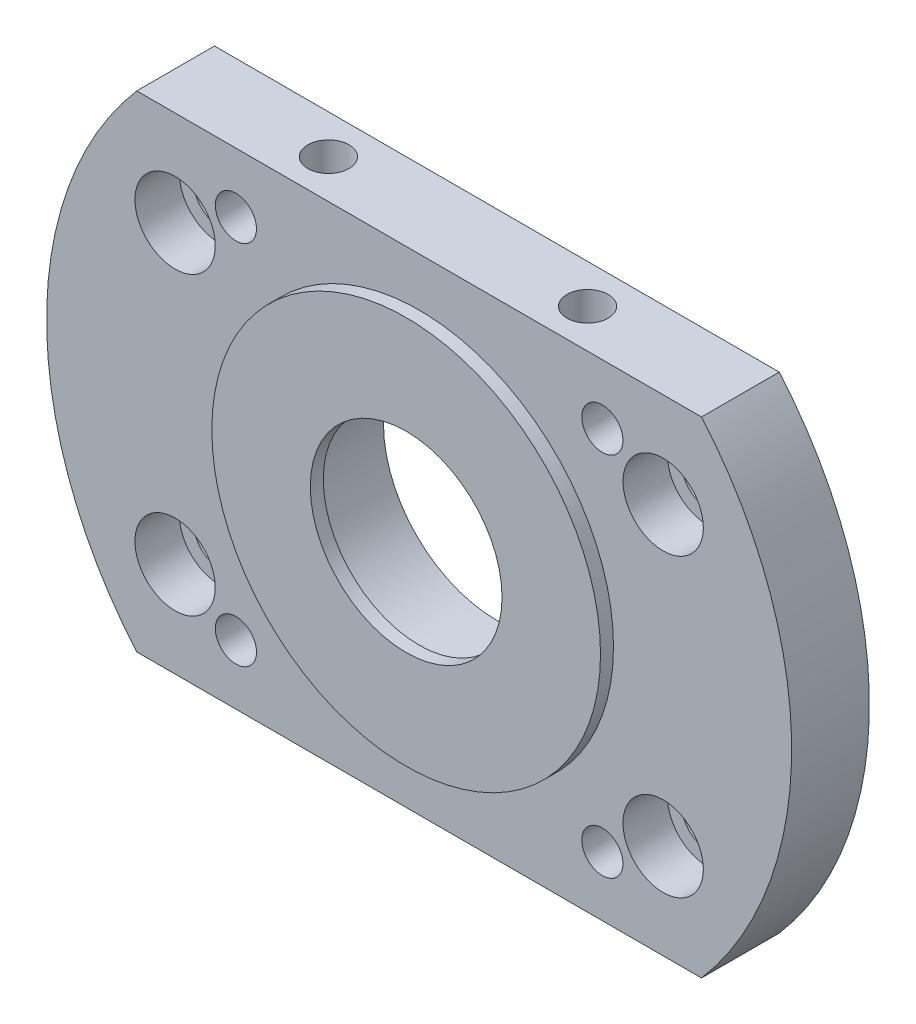
ISO-10303-21;
HEADER;
FILE_DESCRIPTION(('STEP AP214'),'2;1');
FILE_NAME('part.step','',(''),(''),'','','');
FILE_SCHEMA(('AUTOMOTIVE_DESIGN { 1 0 10303 214 1 1 1 1 }'));
ENDSEC;
DATA;
#1=APPLICATION_CONTEXT('core data for automotive mechanical design processes');
#2=APPLICATION_PROTOCOL_DEFINITION('international standard','automotive_design',2000,#1);
#3=PRODUCT_CONTEXT('',#1,'mechanical');
#4=PRODUCT('Part','Part','',(#3));
#5=PRODUCT_RELATED_PRODUCT_CATEGORY('part','',(#4));
#6=PRODUCT_DEFINITION_FORMATION('','',#4);
#7=PRODUCT_DEFINITION_CONTEXT('part definition',#1,'design');
#8=PRODUCT_DEFINITION('design','',#6,#7);
#9=PRODUCT_DEFINITION_SHAPE('','',#8);
#10=(LENGTH_UNIT() NAMED_UNIT(*) SI_UNIT(.MILLI.,.METRE.));
#11=(NAMED_UNIT(*) PLANE_ANGLE_UNIT() SI_UNIT($,.RADIAN.));
#12=(NAMED_UNIT(*) SI_UNIT($,.STERADIAN.) SOLID_ANGLE_UNIT());
#13=UNCERTAINTY_MEASURE_WITH_UNIT(LENGTH_MEASURE(1.E-05),#10,'distance_accuracy_value','');
#14=(GEOMETRIC_REPRESENTATION_CONTEXT(3) GLOBAL_UNCERTAINTY_ASSIGNED_CONTEXT((#13)) GLOBAL_UNIT_ASSIGNED_CONTEXT((#10,
#11,#12)) REPRESENTATION_CONTEXT('',''));
#15=CARTESIAN_POINT('',(0.,0.,0.));
#16=DIRECTION('',(0.,0.,1.));
#17=DIRECTION('',(1.,0.,0.));
#18=AXIS2_PLACEMENT_3D('',#15,#16,#17);
#19=CARTESIAN_POINT('',(0.,0.,8.89000000000001));
#20=DIRECTION('',(0.,0.,1.));
#21=DIRECTION('',(1.,0.,0.));
#22=AXIS2_PLACEMENT_3D('',#19,#20,#21);
#23=PLANE('',#22);
#24=CARTESIAN_POINT('',(0.,0.,8.89000000000001));
#25=DIRECTION('',(0.,0.,-1.));
#26=DIRECTION('',(-1.,0.,0.));
#27=AXIS2_PLACEMENT_3D('',#24,#25,#26);
#28=CIRCLE('',#27,19.05);
#29=CARTESIAN_POINT('',(-19.05,0.,8.89000000000001));
#30=VERTEX_POINT('',#29);
#31=EDGE_CURVE('E197',#30,#30,#28,.T.);
#32=ORIENTED_EDGE('',*,*,#31,.F.);
#33=EDGE_LOOP('',(#32));
#34=FACE_BOUND('',#33,.T.);
#35=CARTESIAN_POINT('',(0.,0.,8.89000000000001));
#36=DIRECTION('',(0.,0.,1.));
#37=DIRECTION('',(1.,0.,0.));
#38=AXIS2_PLACEMENT_3D('',#35,#36,#37);
#39=CIRCLE('',#38,9.398);
#40=CARTESIAN_POINT('',(9.398,0.,8.89000000000001));
#41=VERTEX_POINT('',#40);
#42=EDGE_CURVE('E18',#41,#41,#39,.F.);
#43=ORIENTED_EDGE('',*,*,#42,.T.);
#44=EDGE_LOOP('',(#43));
#45=FACE_BOUND('',#44,.T.);
#46=ADVANCED_FACE('F15',(#34,#45),#23,.T.);
#47=CARTESIAN_POINT('',(0.,0.,0.));
#48=DIRECTION('',(0.,0.,1.));
#49=DIRECTION('',(1.,0.,0.));
#50=AXIS2_PLACEMENT_3D('',#47,#48,#49);
#51=CYLINDRICAL_SURFACE('',#50,9.398);
#52=ORIENTED_EDGE('',*,*,#42,.F.);
#53=EDGE_LOOP('',(#52));
#54=FACE_BOUND('',#53,.T.);
#55=CARTESIAN_POINT('',(0.,0.,7.61999999999999));
#56=DIRECTION('',(0.,0.,1.));
#57=DIRECTION('',(1.,0.,0.));
#58=AXIS2_PLACEMENT_3D('',#55,#56,#57);
#59=CIRCLE('',#58,9.398);
#60=CARTESIAN_POINT('',(9.398,0.,7.61999999999999));
#61=VERTEX_POINT('',#60);
#62=EDGE_CURVE('E79',#61,#61,#59,.T.);
#63=ORIENTED_EDGE('',*,*,#62,.F.);
#64=EDGE_LOOP('',(#63));
#65=FACE_BOUND('',#64,.T.);
#66=ADVANCED_FACE('F72',(#54,#65),#51,.F.);
#67=CARTESIAN_POINT('',(12.7,13.6524999998642,3.81000000000001));
#68=DIRECTION('',(0.,1.,0.));
#69=DIRECTION('',(0.,0.,1.));
#70=AXIS2_PLACEMENT_3D('',#67,#68,#69);
#71=CONICAL_SURFACE('',#70,2.01929999990255,1.0297442584718);
#72=CARTESIAN_POINT('',(12.7,12.4391821518088,3.81000000018616));
#73=VERTEX_POINT('',#72);
#74=VERTEX_LOOP('',#73);
#75=FACE_BOUND('',#74,.T.);
#76=CARTESIAN_POINT('',(12.7,13.6525,3.81000000000001));
#77=DIRECTION('',(0.,1.,0.));
#78=DIRECTION('',(0.,0.,1.));
#79=AXIS2_PLACEMENT_3D('',#76,#77,#78);
#80=CIRCLE('',#79,2.01929999999999);
#81=CARTESIAN_POINT('',(12.7,13.6525,5.8293));
#82=VERTEX_POINT('',#81);
#83=EDGE_CURVE('E76',#82,#82,#80,.T.);
#84=ORIENTED_EDGE('',*,*,#83,.T.);
#85=EDGE_LOOP('',(#84));
#86=FACE_BOUND('',#85,.T.);
#87=ADVANCED_FACE('F68',(#75,#86),#71,.F.);
#88=CARTESIAN_POINT('',(-12.7,13.652499999921,3.81000000000001));
#89=DIRECTION('',(0.,1.,0.));
#90=DIRECTION('',(-1.,0.,0.));
#91=AXIS2_PLACEMENT_3D('',#88,#89,#90);
#92=CONICAL_SURFACE('',#91,2.0192999999594,1.02974425849666);
#93=CARTESIAN_POINT('',(-12.7,12.439182151752,3.80999999991474));
#94=VERTEX_POINT('',#93);
#95=VERTEX_LOOP('',#94);
#96=FACE_BOUND('',#95,.T.);
#97=CARTESIAN_POINT('',(-12.7,13.6525,3.81000000000001));
#98=DIRECTION('',(0.,1.,0.));
#99=DIRECTION('',(0.,0.,1.));
#100=AXIS2_PLACEMENT_3D('',#97,#98,#99);
#101=CIRCLE('',#100,2.01929999999999);
#102=CARTESIAN_POINT('',(-12.7,13.6525,5.8293));
#103=VERTEX_POINT('',#102);
#104=EDGE_CURVE('E78',#103,#103,#101,.T.);
#105=ORIENTED_EDGE('',*,*,#104,.T.);
#106=EDGE_LOOP('',(#105));
#107=FACE_BOUND('',#106,.T.);
#108=ADVANCED_FACE('F71',(#96,#107),#92,.F.);
#109=CARTESIAN_POINT('',(23.920649603501,14.5,7.61999999999999));
#110=DIRECTION('',(0.,0.,1.));
#111=DIRECTION('',(1.,0.,0.));
#112=AXIS2_PLACEMENT_3D('',#109,#110,#111);
#113=CYLINDRICAL_SURFACE('',#112,3.937);
#114=CARTESIAN_POINT('',(23.920649603501,14.5,7.61999999999999));
#115=DIRECTION('',(0.,0.,1.));
#116=DIRECTION('',(1.,0.,0.));
#117=AXIS2_PLACEMENT_3D('',#114,#115,#116);
#118=CIRCLE('',#117,3.937);
#119=CARTESIAN_POINT('',(27.857649603501,14.5,7.61999999999999));
#120=VERTEX_POINT('',#119);
#121=EDGE_CURVE('E82',#120,#120,#118,.F.);
#122=ORIENTED_EDGE('',*,*,#121,.F.);
#123=EDGE_LOOP('',(#122));
#124=FACE_BOUND('',#123,.T.);
#125=CARTESIAN_POINT('',(23.920649603501,14.5,3.25120000000001));
#126=DIRECTION('',(0.,0.,1.));
#127=DIRECTION('',(1.,0.,0.));
#128=AXIS2_PLACEMENT_3D('',#125,#126,#127);
#129=CIRCLE('',#128,3.937);
#130=CARTESIAN_POINT('',(27.857649603501,14.5,3.25120000000001));
#131=VERTEX_POINT('',#130);
#132=EDGE_CURVE('E195',#131,#131,#129,.F.);
#133=ORIENTED_EDGE('',*,*,#132,.T.);
#134=EDGE_LOOP('',(#133));
#135=FACE_BOUND('',#134,.T.);
#136=ADVANCED_FACE('F288',(#124,#135),#113,.F.);
#137=CARTESIAN_POINT('',(23.920649603501,-14.5,7.61999999999999));
#138=DIRECTION('',(0.,0.,1.));
#139=DIRECTION('',(1.,0.,0.));
#140=AXIS2_PLACEMENT_3D('',#137,#138,#139);
#141=CYLINDRICAL_SURFACE('',#140,3.937);
#142=CARTESIAN_POINT('',(23.920649603501,-14.5,7.61999999999999));
#143=DIRECTION('',(0.,0.,1.));
#144=DIRECTION('',(1.,0.,0.));
#145=AXIS2_PLACEMENT_3D('',#142,#143,#144);
#146=CIRCLE('',#145,3.937);
#147=CARTESIAN_POINT('',(27.857649603501,-14.5,7.61999999999999));
#148=VERTEX_POINT('',#147);
#149=EDGE_CURVE('E182',#148,#148,#146,.F.);
#150=ORIENTED_EDGE('',*,*,#149,.F.);
#151=EDGE_LOOP('',(#150));
#152=FACE_BOUND('',#151,.T.);
#153=CARTESIAN_POINT('',(23.920649603501,-14.5,3.25120000000001));
#154=DIRECTION('',(0.,0.,1.));
#155=DIRECTION('',(1.,0.,0.));
#156=AXIS2_PLACEMENT_3D('',#153,#154,#155);
#157=CIRCLE('',#156,3.937);
#158=CARTESIAN_POINT('',(27.857649603501,-14.5,3.25120000000001));
#159=VERTEX_POINT('',#158);
#160=EDGE_CURVE('E192',#159,#159,#157,.F.);
#161=ORIENTED_EDGE('',*,*,#160,.T.);
#162=EDGE_LOOP('',(#161));
#163=FACE_BOUND('',#162,.T.);
#164=ADVANCED_FACE('F284',(#152,#163),#141,.F.);
#165=CARTESIAN_POINT('',(-23.920649603501,-14.5,7.61999999999999));
#166=DIRECTION('',(0.,0.,1.));
#167=DIRECTION('',(1.,0.,0.));
#168=AXIS2_PLACEMENT_3D('',#165,#166,#167);
#169=CYLINDRICAL_SURFACE('',#168,3.937);
#170=CARTESIAN_POINT('',(-23.920649603501,-14.5,7.61999999999999));
#171=DIRECTION('',(0.,0.,1.));
#172=DIRECTION('',(1.,0.,0.));
#173=AXIS2_PLACEMENT_3D('',#170,#171,#172);
#174=CIRCLE('',#173,3.937);
#175=CARTESIAN_POINT('',(-19.983649603501,-14.5,7.61999999999999));
#176=VERTEX_POINT('',#175);
#177=EDGE_CURVE('E179',#176,#176,#174,.F.);
#178=ORIENTED_EDGE('',*,*,#177,.F.);
#179=EDGE_LOOP('',(#178));
#180=FACE_BOUND('',#179,.T.);
#181=CARTESIAN_POINT('',(-23.920649603501,-14.5,3.25120000000001));
#182=DIRECTION('',(0.,0.,1.));
#183=DIRECTION('',(1.,0.,0.));
#184=AXIS2_PLACEMENT_3D('',#181,#182,#183);
#185=CIRCLE('',#184,3.937);
#186=CARTESIAN_POINT('',(-19.983649603501,-14.5,3.25120000000001));
#187=VERTEX_POINT('',#186);
#188=EDGE_CURVE('E189',#187,#187,#185,.F.);
#189=ORIENTED_EDGE('',*,*,#188,.T.);
#190=EDGE_LOOP('',(#189));
#191=FACE_BOUND('',#190,.T.);
#192=ADVANCED_FACE('F280',(#180,#191),#169,.F.);
#193=CARTESIAN_POINT('',(-23.920649603501,14.5,7.61999999999999));
#194=DIRECTION('',(0.,0.,1.));
#195=DIRECTION('',(1.,0.,0.));
#196=AXIS2_PLACEMENT_3D('',#193,#194,#195);
#197=CYLINDRICAL_SURFACE('',#196,3.937);
#198=CARTESIAN_POINT('',(-23.920649603501,14.5,7.61999999999999));
#199=DIRECTION('',(0.,0.,1.));
#200=DIRECTION('',(1.,0.,0.));
#201=AXIS2_PLACEMENT_3D('',#198,#199,#200);
#202=CIRCLE('',#201,3.937);
#203=CARTESIAN_POINT('',(-19.983649603501,14.5,7.61999999999999));
#204=VERTEX_POINT('',#203);
#205=EDGE_CURVE('E176',#204,#204,#202,.F.);
#206=ORIENTED_EDGE('',*,*,#205,.F.);
#207=EDGE_LOOP('',(#206));
#208=FACE_BOUND('',#207,.T.);
#209=CARTESIAN_POINT('',(-23.920649603501,14.5,3.25120000000001));
#210=DIRECTION('',(0.,0.,1.));
#211=DIRECTION('',(1.,0.,0.));
#212=AXIS2_PLACEMENT_3D('',#209,#210,#211);
#213=CIRCLE('',#212,3.937);
#214=CARTESIAN_POINT('',(-19.983649603501,14.5,3.25120000000001));
#215=VERTEX_POINT('',#214);
#216=EDGE_CURVE('E85',#215,#215,#213,.F.);
#217=ORIENTED_EDGE('',*,*,#216,.T.);
#218=EDGE_LOOP('',(#217));
#219=FACE_BOUND('',#218,.T.);
#220=ADVANCED_FACE('F272',(#208,#219),#197,.F.);
#221=CARTESIAN_POINT('',(0.,0.,8.89000000000001));
#222=DIRECTION('',(0.,0.,-1.));
#223=DIRECTION('',(-1.,0.,0.));
#224=AXIS2_PLACEMENT_3D('',#221,#222,#223);
#225=CYLINDRICAL_SURFACE('',#224,19.05);
#226=CARTESIAN_POINT('',(0.,0.,7.61999999999999));
#227=DIRECTION('',(0.,0.,-1.));
#228=DIRECTION('',(-1.,0.,0.));
#229=AXIS2_PLACEMENT_3D('',#226,#227,#228);
#230=CIRCLE('',#229,19.05);
#231=CARTESIAN_POINT('',(-19.05,0.,7.61999999999999));
#232=VERTEX_POINT('',#231);
#233=EDGE_CURVE('E173',#232,#232,#230,.T.);
#234=ORIENTED_EDGE('',*,*,#233,.F.);
#235=EDGE_LOOP('',(#234));
#236=FACE_BOUND('',#235,.T.);
#237=ORIENTED_EDGE('',*,*,#31,.T.);
#238=EDGE_LOOP('',(#237));
#239=FACE_BOUND('',#238,.T.);
#240=ADVANCED_FACE('F261',(#236,#239),#225,.T.);
#241=CARTESIAN_POINT('',(26.473349603501,14.5,3.25120000000001));
#242=DIRECTION('',(0.,0.,-1.));
#243=DIRECTION('',(-1.,0.,0.));
#244=AXIS2_PLACEMENT_3D('',#241,#242,#243);
#245=PLANE('',#244);
#246=ORIENTED_EDGE('',*,*,#132,.F.);
#247=EDGE_LOOP('',(#246));
#248=FACE_BOUND('',#247,.T.);
#249=CARTESIAN_POINT('',(23.920649603501,14.5,3.25120000000001));
#250=DIRECTION('',(0.,0.,1.));
#251=DIRECTION('',(1.,0.,0.));
#252=AXIS2_PLACEMENT_3D('',#249,#250,#251);
#253=CIRCLE('',#252,2.5527);
#254=CARTESIAN_POINT('',(26.473349603501,14.5,3.25120000000001));
#255=VERTEX_POINT('',#254);
#256=EDGE_CURVE('E170',#255,#255,#253,.F.);
#257=ORIENTED_EDGE('',*,*,#256,.T.);
#258=EDGE_LOOP('',(#257));
#259=FACE_BOUND('',#258,.T.);
#260=ADVANCED_FACE('F258',(#248,#259),#245,.F.);
#261=CARTESIAN_POINT('',(26.473349603501,-14.5,3.25120000000001));
#262=DIRECTION('',(0.,0.,-1.));
#263=DIRECTION('',(-1.,0.,0.));
#264=AXIS2_PLACEMENT_3D('',#261,#262,#263);
#265=PLANE('',#264);
#266=ORIENTED_EDGE('',*,*,#160,.F.);
#267=EDGE_LOOP('',(#266));
#268=FACE_BOUND('',#267,.T.);
#269=CARTESIAN_POINT('',(23.920649603501,-14.5,3.25120000000001));
#270=DIRECTION('',(0.,0.,1.));
#271=DIRECTION('',(1.,0.,0.));
#272=AXIS2_PLACEMENT_3D('',#269,#270,#271);
#273=CIRCLE('',#272,2.5527);
#274=CARTESIAN_POINT('',(26.473349603501,-14.5,3.25120000000001));
#275=VERTEX_POINT('',#274);
#276=EDGE_CURVE('E167',#275,#275,#273,.F.);
#277=ORIENTED_EDGE('',*,*,#276,.T.);
#278=EDGE_LOOP('',(#277));
#279=FACE_BOUND('',#278,.T.);
#280=ADVANCED_FACE('F260',(#268,#279),#265,.F.);
#281=CARTESIAN_POINT('',(-21.367949603501,-14.5,3.25120000000001));
#282=DIRECTION('',(0.,0.,-1.));
#283=DIRECTION('',(-1.,0.,0.));
#284=AXIS2_PLACEMENT_3D('',#281,#282,#283);
#285=PLANE('',#284);
#286=ORIENTED_EDGE('',*,*,#188,.F.);
#287=EDGE_LOOP('',(#286));
#288=FACE_BOUND('',#287,.T.);
#289=CARTESIAN_POINT('',(-23.920649603501,-14.5,3.25120000000001));
#290=DIRECTION('',(0.,0.,1.));
#291=DIRECTION('',(1.,0.,0.));
#292=AXIS2_PLACEMENT_3D('',#289,#290,#291);
#293=CIRCLE('',#292,2.5527);
#294=CARTESIAN_POINT('',(-21.367949603501,-14.5,3.25120000000001));
#295=VERTEX_POINT('',#294);
#296=EDGE_CURVE('E164',#295,#295,#293,.F.);
#297=ORIENTED_EDGE('',*,*,#296,.T.);
#298=EDGE_LOOP('',(#297));
#299=FACE_BOUND('',#298,.T.);
#300=ADVANCED_FACE('F269',(#288,#299),#285,.F.);
#301=CARTESIAN_POINT('',(-21.367949603501,14.5,3.25120000000001));
#302=DIRECTION('',(0.,0.,-1.));
#303=DIRECTION('',(-1.,0.,0.));
#304=AXIS2_PLACEMENT_3D('',#301,#302,#303);
#305=PLANE('',#304);
#306=ORIENTED_EDGE('',*,*,#216,.F.);
#307=EDGE_LOOP('',(#306));
#308=FACE_BOUND('',#307,.T.);
#309=CARTESIAN_POINT('',(-23.920649603501,14.5,3.25120000000001));
#310=DIRECTION('',(0.,0.,1.));
#311=DIRECTION('',(1.,0.,0.));
#312=AXIS2_PLACEMENT_3D('',#309,#310,#311);
#313=CIRCLE('',#312,2.5527);
#314=CARTESIAN_POINT('',(-21.367949603501,14.5,3.25120000000001));
#315=VERTEX_POINT('',#314);
#316=EDGE_CURVE('E161',#315,#315,#313,.F.);
#317=ORIENTED_EDGE('',*,*,#316,.T.);
#318=EDGE_LOOP('',(#317));
#319=FACE_BOUND('',#318,.T.);
#320=ADVANCED_FACE('F325',(#308,#319),#305,.F.);
#321=CARTESIAN_POINT('',(-23.920649603501,0.,5.08));
#322=DIRECTION('',(0.,0.,-1.));
#323=DIRECTION('',(-1.,0.,0.));
#324=AXIS2_PLACEMENT_3D('',#321,#322,#323);
#325=PLANE('',#324);
#326=CARTESIAN_POINT('',(-23.920649603501,0.,5.08));
#327=DIRECTION('',(0.,0.,-1.));
#328=DIRECTION('',(-1.,0.,0.));
#329=AXIS2_PLACEMENT_3D('',#326,#327,#328);
#330=CIRCLE('',#329,9.52500000000001);
#331=CARTESIAN_POINT('',(-33.445649603501,0.,5.08));
#332=VERTEX_POINT('',#331);
#333=EDGE_CURVE('E146',#332,#332,#330,.T.);
#334=ORIENTED_EDGE('',*,*,#333,.T.);
#335=EDGE_LOOP('',(#334));
#336=FACE_BOUND('',#335,.T.);
#337=ADVANCED_FACE('F321',(#336),#325,.T.);
#338=CARTESIAN_POINT('',(23.920649603501,0.,5.08));
#339=DIRECTION('',(0.,0.,-1.));
#340=DIRECTION('',(-1.,0.,0.));
#341=AXIS2_PLACEMENT_3D('',#338,#339,#340);
#342=PLANE('',#341);
#343=CARTESIAN_POINT('',(23.920649603501,0.,5.08));
#344=DIRECTION('',(0.,0.,-1.));
#345=DIRECTION('',(-1.,0.,0.));
#346=AXIS2_PLACEMENT_3D('',#343,#344,#345);
#347=CIRCLE('',#346,9.525);
#348=CARTESIAN_POINT('',(14.395649603501,0.,5.08));
#349=VERTEX_POINT('',#348);
#350=EDGE_CURVE('E143',#349,#349,#347,.T.);
#351=ORIENTED_EDGE('',*,*,#350,.T.);
#352=EDGE_LOOP('',(#351));
#353=FACE_BOUND('',#352,.T.);
#354=ADVANCED_FACE('F213',(#353),#342,.T.);
#355=CARTESIAN_POINT('',(0.,0.,7.61999999999999));
#356=DIRECTION('',(0.,0.,-1.));
#357=DIRECTION('',(-1.,0.,0.));
#358=AXIS2_PLACEMENT_3D('',#355,#356,#357);
#359=PLANE('',#358);
#360=ORIENTED_EDGE('',*,*,#62,.T.);
#361=EDGE_LOOP('',(#360));
#362=FACE_BOUND('',#361,.T.);
#363=CARTESIAN_POINT('',(0.,0.,7.61999999999999));
#364=DIRECTION('',(0.,0.,-1.));
#365=DIRECTION('',(-1.,0.,0.));
#366=AXIS2_PLACEMENT_3D('',#363,#364,#365);
#367=CIRCLE('',#366,11.1125);
#368=CARTESIAN_POINT('',(-11.1125,0.,7.61999999999999));
#369=VERTEX_POINT('',#368);
#370=EDGE_CURVE('E139',#369,#369,#367,.T.);
#371=ORIENTED_EDGE('',*,*,#370,.T.);
#372=EDGE_LOOP('',(#371));
#373=FACE_BOUND('',#372,.T.);
#374=ADVANCED_FACE('F209',(#362,#373),#359,.T.);
#375=CARTESIAN_POINT('',(12.7,23.8125,3.81000000000001));
#376=DIRECTION('',(0.,1.,0.));
#377=DIRECTION('',(0.,0.,1.));
#378=AXIS2_PLACEMENT_3D('',#375,#376,#377);
#379=CYLINDRICAL_SURFACE('',#378,2.01929999999999);
#380=ORIENTED_EDGE('',*,*,#83,.F.);
#381=EDGE_LOOP('',(#380));
#382=FACE_BOUND('',#381,.T.);
#383=CARTESIAN_POINT('',(12.7,23.8125,3.81000000000001));
#384=DIRECTION('',(0.,1.,0.));
#385=DIRECTION('',(0.,0.,1.));
#386=AXIS2_PLACEMENT_3D('',#383,#384,#385);
#387=CIRCLE('',#386,2.01929999999999);
#388=CARTESIAN_POINT('',(12.7,23.8125,5.8293));
#389=VERTEX_POINT('',#388);
#390=EDGE_CURVE('E133',#389,#389,#387,.T.);
#391=ORIENTED_EDGE('',*,*,#390,.T.);
#392=EDGE_LOOP('',(#391));
#393=FACE_BOUND('',#392,.T.);
#394=ADVANCED_FACE('F212',(#382,#393),#379,.F.);
#395=CARTESIAN_POINT('',(-12.7,23.8125,3.81000000000001));
#396=DIRECTION('',(0.,1.,0.));
#397=DIRECTION('',(0.,0.,1.));
#398=AXIS2_PLACEMENT_3D('',#395,#396,#397);
#399=CYLINDRICAL_SURFACE('',#398,2.01929999999999);
#400=ORIENTED_EDGE('',*,*,#104,.F.);
#401=EDGE_LOOP('',(#400));
#402=FACE_BOUND('',#401,.T.);
#403=CARTESIAN_POINT('',(-12.7,23.8125,3.81000000000001));
#404=DIRECTION('',(0.,1.,0.));
#405=DIRECTION('',(0.,0.,1.));
#406=AXIS2_PLACEMENT_3D('',#403,#404,#405);
#407=CIRCLE('',#406,2.01929999999999);
#408=CARTESIAN_POINT('',(-12.7,23.8125,5.8293));
#409=VERTEX_POINT('',#408);
#410=EDGE_CURVE('E129',#409,#409,#407,.T.);
#411=ORIENTED_EDGE('',*,*,#410,.T.);
#412=EDGE_LOOP('',(#411));
#413=FACE_BOUND('',#412,.T.);
#414=ADVANCED_FACE('F299',(#402,#413),#399,.F.);
#415=CARTESIAN_POINT('',(0.,0.,7.61999999999999));
#416=DIRECTION('',(0.,0.,1.));
#417=DIRECTION('',(1.,0.,0.));
#418=AXIS2_PLACEMENT_3D('',#415,#416,#417);
#419=PLANE('',#418);
#420=CARTESIAN_POINT('',(0.,0.,7.61999999999999));
#421=DIRECTION('',(0.,0.,-1.));
#422=DIRECTION('',(-1.,0.,0.));
#423=AXIS2_PLACEMENT_3D('',#420,#421,#422);
#424=CIRCLE('',#423,36.5125);
#425=CARTESIAN_POINT('',(27.6790082914833,23.8125,7.61999999999999));
#426=VERTEX_POINT('',#425);
#427=CARTESIAN_POINT('',(27.6790082914833,-23.8125,7.61999999999999));
#428=VERTEX_POINT('',#427);
#429=EDGE_CURVE('E56',#426,#428,#424,.T.);
#430=ORIENTED_EDGE('',*,*,#429,.F.);
#431=DIRECTION('',(1.,0.,0.));
#432=VECTOR('',#431,1.);
#433=CARTESIAN_POINT('',(-27.6790082914833,23.8125,7.61999999999999));
#434=LINE('',#433,#432);
#435=CARTESIAN_POINT('',(-27.6790082914833,23.8125,7.61999999999999));
#436=VERTEX_POINT('',#435);
#437=EDGE_CURVE('E128',#426,#436,#434,.F.);
#438=ORIENTED_EDGE('',*,*,#437,.T.);
#439=CARTESIAN_POINT('',(0.,0.,7.61999999999999));
#440=DIRECTION('',(0.,0.,-1.));
#441=DIRECTION('',(-1.,0.,0.));
#442=AXIS2_PLACEMENT_3D('',#439,#440,#441);
#443=CIRCLE('',#442,36.5125);
#444=CARTESIAN_POINT('',(-27.6790082914833,-23.8125,7.61999999999999));
#445=VERTEX_POINT('',#444);
#446=EDGE_CURVE('E62',#445,#436,#443,.T.);
#447=ORIENTED_EDGE('',*,*,#446,.F.);
#448=DIRECTION('',(1.,0.,0.));
#449=VECTOR('',#448,1.);
#450=CARTESIAN_POINT('',(-27.6790082914833,-23.8125,7.61999999999999));
#451=LINE('',#450,#449);
#452=EDGE_CURVE('E138',#445,#428,#451,.T.);
#453=ORIENTED_EDGE('',*,*,#452,.T.);
#454=EDGE_LOOP('',(#430,#438,#447,#453));
#455=FACE_BOUND('',#454,.T.);
#456=ORIENTED_EDGE('',*,*,#233,.T.);
#457=EDGE_LOOP('',(#456));
#458=FACE_BOUND('',#457,.T.);
#459=CARTESIAN_POINT('',(17.9605122421383,-17.9605122421383,7.61999999999999));
#460=DIRECTION('',(0.,0.,-1.));
#461=DIRECTION('',(-1.,0.,0.));
#462=AXIS2_PLACEMENT_3D('',#459,#460,#461);
#463=CIRCLE('',#462,2.01929999999999);
#464=CARTESIAN_POINT('',(15.9412122421383,-17.9605122421383,7.61999999999999));
#465=VERTEX_POINT('',#464);
#466=EDGE_CURVE('E149',#465,#465,#463,.T.);
#467=ORIENTED_EDGE('',*,*,#466,.T.);
#468=EDGE_LOOP('',(#467));
#469=FACE_BOUND('',#468,.T.);
#470=CARTESIAN_POINT('',(-17.9605122421383,-17.9605122421383,7.61999999999999));
#471=DIRECTION('',(0.,0.,-1.));
#472=DIRECTION('',(-1.,0.,0.));
#473=AXIS2_PLACEMENT_3D('',#470,#471,#472);
#474=CIRCLE('',#473,2.01929999999999);
#475=CARTESIAN_POINT('',(-19.9798122421383,-17.9605122421383,7.61999999999999));
#476=VERTEX_POINT('',#475);
#477=EDGE_CURVE('E152',#476,#476,#474,.T.);
#478=ORIENTED_EDGE('',*,*,#477,.T.);
#479=EDGE_LOOP('',(#478));
#480=FACE_BOUND('',#479,.T.);
#481=CARTESIAN_POINT('',(-17.9605122421383,17.9605122421383,7.61999999999999));
#482=DIRECTION('',(0.,0.,-1.));
#483=DIRECTION('',(-1.,0.,0.));
#484=AXIS2_PLACEMENT_3D('',#481,#482,#483);
#485=CIRCLE('',#484,2.01929999999999);
#486=CARTESIAN_POINT('',(-19.9798122421383,17.9605122421383,7.61999999999999));
#487=VERTEX_POINT('',#486);
#488=EDGE_CURVE('E155',#487,#487,#485,.T.);
#489=ORIENTED_EDGE('',*,*,#488,.T.);
#490=EDGE_LOOP('',(#489));
#491=FACE_BOUND('',#490,.T.);
#492=CARTESIAN_POINT('',(17.9605122421383,17.9605122421383,7.61999999999999));
#493=DIRECTION('',(0.,0.,-1.));
#494=DIRECTION('',(-1.,0.,0.));
#495=AXIS2_PLACEMENT_3D('',#492,#493,#494);
#496=CIRCLE('',#495,2.01929999999999);
#497=CARTESIAN_POINT('',(15.9412122421383,17.9605122421383,7.61999999999999));
#498=VERTEX_POINT('',#497);
#499=EDGE_CURVE('E158',#498,#498,#496,.T.);
#500=ORIENTED_EDGE('',*,*,#499,.T.);
#501=EDGE_LOOP('',(#500));
#502=FACE_BOUND('',#501,.T.);
#503=ORIENTED_EDGE('',*,*,#205,.T.);
#504=EDGE_LOOP('',(#503));
#505=FACE_BOUND('',#504,.T.);
#506=ORIENTED_EDGE('',*,*,#177,.T.);
#507=EDGE_LOOP('',(#506));
#508=FACE_BOUND('',#507,.T.);
#509=ORIENTED_EDGE('',*,*,#149,.T.);
#510=EDGE_LOOP('',(#509));
#511=FACE_BOUND('',#510,.T.);
#512=ORIENTED_EDGE('',*,*,#121,.T.);
#513=EDGE_LOOP('',(#512));
#514=FACE_BOUND('',#513,.T.);
#515=ADVANCED_FACE('F254',(#455,#458,#469,#480,#491,#502,#505,#508,#511,#514),#419,.T.);
#516=CARTESIAN_POINT('',(23.920649603501,14.5,7.61999999999999));
#517=DIRECTION('',(0.,0.,1.));
#518=DIRECTION('',(1.,0.,0.));
#519=AXIS2_PLACEMENT_3D('',#516,#517,#518);
#520=CYLINDRICAL_SURFACE('',#519,2.5527);
#521=CARTESIAN_POINT('',(23.920649603501,14.5,0.));
#522=DIRECTION('',(0.,0.,1.));
#523=DIRECTION('',(1.,0.,0.));
#524=AXIS2_PLACEMENT_3D('',#521,#522,#523);
#525=CIRCLE('',#524,2.5527);
#526=CARTESIAN_POINT('',(26.473349603501,14.5,0.));
#527=VERTEX_POINT('',#526);
#528=EDGE_CURVE('E123',#527,#527,#525,.F.);
#529=ORIENTED_EDGE('',*,*,#528,.T.);
#530=EDGE_LOOP('',(#529));
#531=FACE_BOUND('',#530,.T.);
#532=ORIENTED_EDGE('',*,*,#256,.F.);
#533=EDGE_LOOP('',(#532));
#534=FACE_BOUND('',#533,.T.);
#535=ADVANCED_FACE('F250',(#531,#534),#520,.F.);
#536=CARTESIAN_POINT('',(23.920649603501,-14.5,7.61999999999999));
#537=DIRECTION('',(0.,0.,1.));
#538=DIRECTION('',(1.,0.,0.));
#539=AXIS2_PLACEMENT_3D('',#536,#537,#538);
#540=CYLINDRICAL_SURFACE('',#539,2.5527);
#541=CARTESIAN_POINT('',(23.920649603501,-14.5,0.));
#542=DIRECTION('',(0.,0.,1.));
#543=DIRECTION('',(1.,0.,0.));
#544=AXIS2_PLACEMENT_3D('',#541,#542,#543);
#545=CIRCLE('',#544,2.5527);
#546=CARTESIAN_POINT('',(26.473349603501,-14.5,0.));
#547=VERTEX_POINT('',#546);
#548=EDGE_CURVE('E120',#547,#547,#545,.F.);
#549=ORIENTED_EDGE('',*,*,#548,.T.);
#550=EDGE_LOOP('',(#549));
#551=FACE_BOUND('',#550,.T.);
#552=ORIENTED_EDGE('',*,*,#276,.F.);
#553=EDGE_LOOP('',(#552));
#554=FACE_BOUND('',#553,.T.);
#555=ADVANCED_FACE('F253',(#551,#554),#540,.F.);
#556=CARTESIAN_POINT('',(-23.920649603501,-14.5,7.61999999999999));
#557=DIRECTION('',(0.,0.,1.));
#558=DIRECTION('',(1.,0.,0.));
#559=AXIS2_PLACEMENT_3D('',#556,#557,#558);
#560=CYLINDRICAL_SURFACE('',#559,2.5527);
#561=CARTESIAN_POINT('',(-23.920649603501,-14.5,0.));
#562=DIRECTION('',(0.,0.,1.));
#563=DIRECTION('',(1.,0.,0.));
#564=AXIS2_PLACEMENT_3D('',#561,#562,#563);
#565=CIRCLE('',#564,2.5527);
#566=CARTESIAN_POINT('',(-21.367949603501,-14.5,0.));
#567=VERTEX_POINT('',#566);
#568=EDGE_CURVE('E117',#567,#567,#565,.F.);
#569=ORIENTED_EDGE('',*,*,#568,.T.);
#570=EDGE_LOOP('',(#569));
#571=FACE_BOUND('',#570,.T.);
#572=ORIENTED_EDGE('',*,*,#296,.F.);
#573=EDGE_LOOP('',(#572));
#574=FACE_BOUND('',#573,.T.);
#575=ADVANCED_FACE('F337',(#571,#574),#560,.F.);
#576=CARTESIAN_POINT('',(-23.920649603501,14.5,7.61999999999999));
#577=DIRECTION('',(0.,0.,1.));
#578=DIRECTION('',(1.,0.,0.));
#579=AXIS2_PLACEMENT_3D('',#576,#577,#578);
#580=CYLINDRICAL_SURFACE('',#579,2.5527);
#581=CARTESIAN_POINT('',(-23.920649603501,14.5,0.));
#582=DIRECTION('',(0.,0.,1.));
#583=DIRECTION('',(1.,0.,0.));
#584=AXIS2_PLACEMENT_3D('',#581,#582,#583);
#585=CIRCLE('',#584,2.5527);
#586=CARTESIAN_POINT('',(-21.367949603501,14.5,0.));
#587=VERTEX_POINT('',#586);
#588=EDGE_CURVE('E114',#587,#587,#585,.F.);
#589=ORIENTED_EDGE('',*,*,#588,.T.);
#590=EDGE_LOOP('',(#589));
#591=FACE_BOUND('',#590,.T.);
#592=ORIENTED_EDGE('',*,*,#316,.F.);
#593=EDGE_LOOP('',(#592));
#594=FACE_BOUND('',#593,.T.);
#595=ADVANCED_FACE('F339',(#591,#594),#580,.F.);
#596=CARTESIAN_POINT('',(17.9605122421383,17.9605122421383,0.));
#597=DIRECTION('',(0.,0.,-1.));
#598=DIRECTION('',(-1.,0.,0.));
#599=AXIS2_PLACEMENT_3D('',#596,#597,#598);
#600=CYLINDRICAL_SURFACE('',#599,2.01929999999999);
#601=ORIENTED_EDGE('',*,*,#499,.F.);
#602=EDGE_LOOP('',(#601));
#603=FACE_BOUND('',#602,.T.);
#604=CARTESIAN_POINT('',(17.9605122421383,17.9605122421383,0.));
#605=DIRECTION('',(0.,0.,-1.));
#606=DIRECTION('',(-1.,0.,0.));
#607=AXIS2_PLACEMENT_3D('',#604,#605,#606);
#608=CIRCLE('',#607,2.01929999999999);
#609=CARTESIAN_POINT('',(15.9412122421383,17.9605122421383,0.));
#610=VERTEX_POINT('',#609);
#611=EDGE_CURVE('E111',#610,#610,#608,.T.);
#612=ORIENTED_EDGE('',*,*,#611,.T.);
#613=EDGE_LOOP('',(#612));
#614=FACE_BOUND('',#613,.T.);
#615=ADVANCED_FACE('F346',(#603,#614),#600,.F.);
#616=CARTESIAN_POINT('',(-17.9605122421383,17.9605122421383,0.));
#617=DIRECTION('',(0.,0.,-1.));
#618=DIRECTION('',(-1.,0.,0.));
#619=AXIS2_PLACEMENT_3D('',#616,#617,#618);
#620=CYLINDRICAL_SURFACE('',#619,2.01929999999999);
#621=ORIENTED_EDGE('',*,*,#488,.F.);
#622=EDGE_LOOP('',(#621));
#623=FACE_BOUND('',#622,.T.);
#624=CARTESIAN_POINT('',(-17.9605122421383,17.9605122421383,0.));
#625=DIRECTION('',(0.,0.,-1.));
#626=DIRECTION('',(-1.,0.,0.));
#627=AXIS2_PLACEMENT_3D('',#624,#625,#626);
#628=CIRCLE('',#627,2.01929999999999);
#629=CARTESIAN_POINT('',(-19.9798122421383,17.9605122421383,0.));
#630=VERTEX_POINT('',#629);
#631=EDGE_CURVE('E108',#630,#630,#628,.T.);
#632=ORIENTED_EDGE('',*,*,#631,.T.);
#633=EDGE_LOOP('',(#632));
#634=FACE_BOUND('',#633,.T.);
#635=ADVANCED_FACE('F389',(#623,#634),#620,.F.);
#636=CARTESIAN_POINT('',(-17.9605122421383,-17.9605122421383,0.));
#637=DIRECTION('',(0.,0.,-1.));
#638=DIRECTION('',(-1.,0.,0.));
#639=AXIS2_PLACEMENT_3D('',#636,#637,#638);
#640=CYLINDRICAL_SURFACE('',#639,2.01929999999999);
#641=ORIENTED_EDGE('',*,*,#477,.F.);
#642=EDGE_LOOP('',(#641));
#643=FACE_BOUND('',#642,.T.);
#644=CARTESIAN_POINT('',(-17.9605122421383,-17.9605122421383,0.));
#645=DIRECTION('',(0.,0.,-1.));
#646=DIRECTION('',(-1.,0.,0.));
#647=AXIS2_PLACEMENT_3D('',#644,#645,#646);
#648=CIRCLE('',#647,2.01929999999999);
#649=CARTESIAN_POINT('',(-19.9798122421383,-17.9605122421383,0.));
#650=VERTEX_POINT('',#649);
#651=EDGE_CURVE('E105',#650,#650,#648,.T.);
#652=ORIENTED_EDGE('',*,*,#651,.T.);
#653=EDGE_LOOP('',(#652));
#654=FACE_BOUND('',#653,.T.);
#655=ADVANCED_FACE('F393',(#643,#654),#640,.F.);
#656=CARTESIAN_POINT('',(17.9605122421383,-17.9605122421383,0.));
#657=DIRECTION('',(0.,0.,-1.));
#658=DIRECTION('',(-1.,0.,0.));
#659=AXIS2_PLACEMENT_3D('',#656,#657,#658);
#660=CYLINDRICAL_SURFACE('',#659,2.01929999999999);
#661=ORIENTED_EDGE('',*,*,#466,.F.);
#662=EDGE_LOOP('',(#661));
#663=FACE_BOUND('',#662,.T.);
#664=CARTESIAN_POINT('',(17.9605122421383,-17.9605122421383,0.));
#665=DIRECTION('',(0.,0.,-1.));
#666=DIRECTION('',(-1.,0.,0.));
#667=AXIS2_PLACEMENT_3D('',#664,#665,#666);
#668=CIRCLE('',#667,2.01929999999999);
#669=CARTESIAN_POINT('',(15.9412122421383,-17.9605122421383,0.));
#670=VERTEX_POINT('',#669);
#671=EDGE_CURVE('E102',#670,#670,#668,.T.);
#672=ORIENTED_EDGE('',*,*,#671,.T.);
#673=EDGE_LOOP('',(#672));
#674=FACE_BOUND('',#673,.T.);
#675=ADVANCED_FACE('F399',(#663,#674),#660,.F.);
#676=CARTESIAN_POINT('',(-23.920649603501,0.,5.08));
#677=DIRECTION('',(0.,0.,-1.));
#678=DIRECTION('',(-1.,0.,0.));
#679=AXIS2_PLACEMENT_3D('',#676,#677,#678);
#680=CYLINDRICAL_SURFACE('',#679,9.52500000000001);
#681=ORIENTED_EDGE('',*,*,#333,.F.);
#682=EDGE_LOOP('',(#681));
#683=FACE_BOUND('',#682,.T.);
#684=CARTESIAN_POINT('',(-23.920649603501,0.,0.));
#685=DIRECTION('',(0.,0.,-1.));
#686=DIRECTION('',(-1.,0.,0.));
#687=AXIS2_PLACEMENT_3D('',#684,#685,#686);
#688=CIRCLE('',#687,9.52500000000001);
#689=CARTESIAN_POINT('',(-33.445649603501,0.,0.));
#690=VERTEX_POINT('',#689);
#691=EDGE_CURVE('E99',#690,#690,#688,.T.);
#692=ORIENTED_EDGE('',*,*,#691,.T.);
#693=EDGE_LOOP('',(#692));
#694=FACE_BOUND('',#693,.T.);
#695=ADVANCED_FACE('F403',(#683,#694),#680,.F.);
#696=CARTESIAN_POINT('',(23.920649603501,0.,5.08));
#697=DIRECTION('',(0.,0.,-1.));
#698=DIRECTION('',(-1.,0.,0.));
#699=AXIS2_PLACEMENT_3D('',#696,#697,#698);
#700=CYLINDRICAL_SURFACE('',#699,9.525);
#701=ORIENTED_EDGE('',*,*,#350,.F.);
#702=EDGE_LOOP('',(#701));
#703=FACE_BOUND('',#702,.T.);
#704=CARTESIAN_POINT('',(23.920649603501,0.,0.));
#705=DIRECTION('',(0.,0.,-1.));
#706=DIRECTION('',(-1.,0.,0.));
#707=AXIS2_PLACEMENT_3D('',#704,#705,#706);
#708=CIRCLE('',#707,9.525);
#709=CARTESIAN_POINT('',(14.395649603501,0.,0.));
#710=VERTEX_POINT('',#709);
#711=EDGE_CURVE('E96',#710,#710,#708,.T.);
#712=ORIENTED_EDGE('',*,*,#711,.T.);
#713=EDGE_LOOP('',(#712));
#714=FACE_BOUND('',#713,.T.);
#715=ADVANCED_FACE('F221',(#703,#714),#700,.F.);
#716=CARTESIAN_POINT('',(0.,0.,7.61999999999999));
#717=DIRECTION('',(0.,0.,-1.));
#718=DIRECTION('',(-1.,0.,0.));
#719=AXIS2_PLACEMENT_3D('',#716,#717,#718);
#720=CYLINDRICAL_SURFACE('',#719,11.1125);
#721=ORIENTED_EDGE('',*,*,#370,.F.);
#722=EDGE_LOOP('',(#721));
#723=FACE_BOUND('',#722,.T.);
#724=CARTESIAN_POINT('',(0.,0.,0.));
#725=DIRECTION('',(0.,0.,-1.));
#726=DIRECTION('',(-1.,0.,0.));
#727=AXIS2_PLACEMENT_3D('',#724,#725,#726);
#728=CIRCLE('',#727,11.1125);
#729=CARTESIAN_POINT('',(-11.1125,0.,0.));
#730=VERTEX_POINT('',#729);
#731=EDGE_CURVE('E93',#730,#730,#728,.T.);
#732=ORIENTED_EDGE('',*,*,#731,.T.);
#733=EDGE_LOOP('',(#732));
#734=FACE_BOUND('',#733,.T.);
#735=ADVANCED_FACE('F217',(#723,#734),#720,.F.);
#736=CARTESIAN_POINT('',(-27.6790082914833,-23.8125,7.61999999999999));
#737=DIRECTION('',(0.,1.,0.));
#738=DIRECTION('',(0.,0.,1.));
#739=AXIS2_PLACEMENT_3D('',#736,#737,#738);
#740=PLANE('',#739);
#741=DIRECTION('',(0.,0.,-1.));
#742=VECTOR('',#741,1.);
#743=CARTESIAN_POINT('',(27.6790082914833,-23.8125,7.61999999999999));
#744=LINE('',#743,#742);
#745=CARTESIAN_POINT('',(27.6790082914833,-23.8125,0.));
#746=VERTEX_POINT('',#745);
#747=EDGE_CURVE('E136',#428,#746,#744,.T.);
#748=ORIENTED_EDGE('',*,*,#747,.F.);
#749=ORIENTED_EDGE('',*,*,#452,.F.);
#750=DIRECTION('',(0.,0.,1.));
#751=VECTOR('',#750,1.);
#752=CARTESIAN_POINT('',(-27.6790082914833,-23.8125,7.61999999999999));
#753=LINE('',#752,#751);
#754=CARTESIAN_POINT('',(-27.6790082914833,-23.8125,0.));
#755=VERTEX_POINT('',#754);
#756=EDGE_CURVE('E142',#755,#445,#753,.T.);
#757=ORIENTED_EDGE('',*,*,#756,.F.);
#758=DIRECTION('',(1.,0.,0.));
#759=VECTOR('',#758,1.);
#760=CARTESIAN_POINT('',(0.,-23.8125,0.));
#761=LINE('',#760,#759);
#762=EDGE_CURVE('E91',#755,#746,#761,.T.);
#763=ORIENTED_EDGE('',*,*,#762,.T.);
#764=EDGE_LOOP('',(#748,#749,#757,#763));
#765=FACE_BOUND('',#764,.T.);
#766=ADVANCED_FACE('F220',(#765),#740,.F.);
#767=CARTESIAN_POINT('',(0.,0.,7.61999999999999));
#768=DIRECTION('',(0.,0.,-1.));
#769=DIRECTION('',(-1.,0.,0.));
#770=AXIS2_PLACEMENT_3D('',#767,#768,#769);
#771=CYLINDRICAL_SURFACE('',#770,36.5125);
#772=ORIENTED_EDGE('',*,*,#429,.T.);
#773=ORIENTED_EDGE('',*,*,#747,.T.);
#774=CARTESIAN_POINT('',(0.,0.,0.));
#775=DIRECTION('',(0.,0.,-1.));
#776=DIRECTION('',(-1.,0.,0.));
#777=AXIS2_PLACEMENT_3D('',#774,#775,#776);
#778=CIRCLE('',#777,36.5125);
#779=CARTESIAN_POINT('',(27.6790082914833,23.8125,0.));
#780=VERTEX_POINT('',#779);
#781=EDGE_CURVE('E24',#746,#780,#778,.F.);
#782=ORIENTED_EDGE('',*,*,#781,.T.);
#783=DIRECTION('',(0.,0.,-1.));
#784=VECTOR('',#783,1.);
#785=CARTESIAN_POINT('',(27.6790082914833,23.8125,7.61999999999999));
#786=LINE('',#785,#784);
#787=EDGE_CURVE('E132',#780,#426,#786,.F.);
#788=ORIENTED_EDGE('',*,*,#787,.T.);
#789=EDGE_LOOP('',(#772,#773,#782,#788));
#790=FACE_BOUND('',#789,.T.);
#791=ADVANCED_FACE('F308',(#790),#771,.T.);
#792=CARTESIAN_POINT('',(-27.6790082914833,23.8125,7.61999999999999));
#793=DIRECTION('',(0.,-1.,0.));
#794=DIRECTION('',(0.,0.,-1.));
#795=AXIS2_PLACEMENT_3D('',#792,#793,#794);
#796=PLANE('',#795);
#797=DIRECTION('',(0.,0.,-1.));
#798=VECTOR('',#797,1.);
#799=CARTESIAN_POINT('',(-27.6790082914833,23.8125,7.61999999999999));
#800=LINE('',#799,#798);
#801=CARTESIAN_POINT('',(-27.6790082914833,23.8125,0.));
#802=VERTEX_POINT('',#801);
#803=EDGE_CURVE('E126',#436,#802,#800,.T.);
#804=ORIENTED_EDGE('',*,*,#803,.F.);
#805=ORIENTED_EDGE('',*,*,#437,.F.);
#806=ORIENTED_EDGE('',*,*,#787,.F.);
#807=DIRECTION('',(1.,0.,0.));
#808=VECTOR('',#807,1.);
#809=CARTESIAN_POINT('',(0.,23.8125,0.));
#810=LINE('',#809,#808);
#811=EDGE_CURVE('E10',#780,#802,#810,.F.);
#812=ORIENTED_EDGE('',*,*,#811,.T.);
#813=EDGE_LOOP('',(#804,#805,#806,#812));
#814=FACE_BOUND('',#813,.T.);
#815=ORIENTED_EDGE('',*,*,#410,.F.);
#816=EDGE_LOOP('',(#815));
#817=FACE_BOUND('',#816,.T.);
#818=ORIENTED_EDGE('',*,*,#390,.F.);
#819=EDGE_LOOP('',(#818));
#820=FACE_BOUND('',#819,.T.);
#821=ADVANCED_FACE('F305',(#814,#817,#820),#796,.F.);
#822=CARTESIAN_POINT('',(0.,0.,7.61999999999999));
#823=DIRECTION('',(0.,0.,-1.));
#824=DIRECTION('',(-1.,0.,0.));
#825=AXIS2_PLACEMENT_3D('',#822,#823,#824);
#826=CYLINDRICAL_SURFACE('',#825,36.5125);
#827=ORIENTED_EDGE('',*,*,#803,.T.);
#828=CARTESIAN_POINT('',(0.,0.,0.));
#829=DIRECTION('',(0.,0.,-1.));
#830=DIRECTION('',(-1.,0.,0.));
#831=AXIS2_PLACEMENT_3D('',#828,#829,#830);
#832=CIRCLE('',#831,36.5125);
#833=EDGE_CURVE('E33',#802,#755,#832,.F.);
#834=ORIENTED_EDGE('',*,*,#833,.T.);
#835=ORIENTED_EDGE('',*,*,#756,.T.);
#836=ORIENTED_EDGE('',*,*,#446,.T.);
#837=EDGE_LOOP('',(#827,#834,#835,#836));
#838=FACE_BOUND('',#837,.T.);
#839=ADVANCED_FACE('F228',(#838),#826,.T.);
#840=CARTESIAN_POINT('',(0.,0.,0.));
#841=DIRECTION('',(0.,0.,1.));
#842=DIRECTION('',(1.,0.,0.));
#843=AXIS2_PLACEMENT_3D('',#840,#841,#842);
#844=PLANE('',#843);
#845=ORIENTED_EDGE('',*,*,#811,.F.);
#846=ORIENTED_EDGE('',*,*,#781,.F.);
#847=ORIENTED_EDGE('',*,*,#762,.F.);
#848=ORIENTED_EDGE('',*,*,#833,.F.);
#849=EDGE_LOOP('',(#845,#846,#847,#848));
#850=FACE_BOUND('',#849,.T.);
#851=ORIENTED_EDGE('',*,*,#731,.F.);
#852=EDGE_LOOP('',(#851));
#853=FACE_BOUND('',#852,.T.);
#854=ORIENTED_EDGE('',*,*,#711,.F.);
#855=EDGE_LOOP('',(#854));
#856=FACE_BOUND('',#855,.T.);
#857=ORIENTED_EDGE('',*,*,#691,.F.);
#858=EDGE_LOOP('',(#857));
#859=FACE_BOUND('',#858,.T.);
#860=ORIENTED_EDGE('',*,*,#671,.F.);
#861=EDGE_LOOP('',(#860));
#862=FACE_BOUND('',#861,.T.);
#863=ORIENTED_EDGE('',*,*,#651,.F.);
#864=EDGE_LOOP('',(#863));
#865=FACE_BOUND('',#864,.T.);
#866=ORIENTED_EDGE('',*,*,#631,.F.);
#867=EDGE_LOOP('',(#866));
#868=FACE_BOUND('',#867,.T.);
#869=ORIENTED_EDGE('',*,*,#611,.F.);
#870=EDGE_LOOP('',(#869));
#871=FACE_BOUND('',#870,.T.);
#872=ORIENTED_EDGE('',*,*,#588,.F.);
#873=EDGE_LOOP('',(#872));
#874=FACE_BOUND('',#873,.T.);
#875=ORIENTED_EDGE('',*,*,#568,.F.);
#876=EDGE_LOOP('',(#875));
#877=FACE_BOUND('',#876,.T.);
#878=ORIENTED_EDGE('',*,*,#548,.F.);
#879=EDGE_LOOP('',(#878));
#880=FACE_BOUND('',#879,.T.);
#881=ORIENTED_EDGE('',*,*,#528,.F.);
#882=EDGE_LOOP('',(#881));
#883=FACE_BOUND('',#882,.T.);
#884=ADVANCED_FACE('F225',(#850,#853,#856,#859,#862,#865,#868,#871,#874,#877,#880,#883),#844,.F.);
#885=CLOSED_SHELL('',(#46,#66,#87,#108,#136,#164,#192,#220,#240,#260,#280,#300,#320,#337,#354,
#374,#394,#414,#515,#535,#555,#575,#595,#615,#635,#655,#675,#695,#715,#735,#766,#791,#821,#839,#884));
#886=MANIFOLD_SOLID_BREP('B1',#885);
#887=ADVANCED_BREP_SHAPE_REPRESENTATION('',(#18,#886),#14);
#888=SHAPE_DEFINITION_REPRESENTATION(#9,#887);
ENDSEC;
END-ISO-10303-21;
